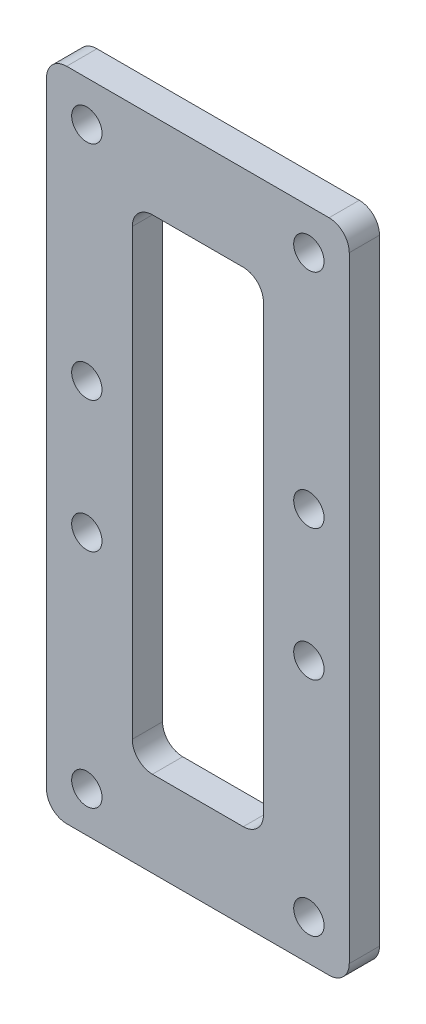
ISO-10303-21;
HEADER;
FILE_DESCRIPTION(('STEP AP214'),'2;1');
FILE_NAME('part.step','',(''),(''),'','','');
FILE_SCHEMA(('AUTOMOTIVE_DESIGN { 1 0 10303 214 1 1 1 1 }'));
ENDSEC;
DATA;
#1=APPLICATION_CONTEXT('core data for automotive mechanical design processes');
#2=APPLICATION_PROTOCOL_DEFINITION('international standard','automotive_design',2000,#1);
#3=PRODUCT_CONTEXT('',#1,'mechanical');
#4=PRODUCT('Part','Part','',(#3));
#5=PRODUCT_RELATED_PRODUCT_CATEGORY('part','',(#4));
#6=PRODUCT_DEFINITION_FORMATION('','',#4);
#7=PRODUCT_DEFINITION_CONTEXT('part definition',#1,'design');
#8=PRODUCT_DEFINITION('design','',#6,#7);
#9=PRODUCT_DEFINITION_SHAPE('','',#8);
#10=(LENGTH_UNIT() NAMED_UNIT(*) SI_UNIT(.MILLI.,.METRE.));
#11=(NAMED_UNIT(*) PLANE_ANGLE_UNIT() SI_UNIT($,.RADIAN.));
#12=(NAMED_UNIT(*) SI_UNIT($,.STERADIAN.) SOLID_ANGLE_UNIT());
#13=UNCERTAINTY_MEASURE_WITH_UNIT(LENGTH_MEASURE(1.E-05),#10,'distance_accuracy_value','');
#14=(GEOMETRIC_REPRESENTATION_CONTEXT(3) GLOBAL_UNCERTAINTY_ASSIGNED_CONTEXT((#13)) GLOBAL_UNIT_ASSIGNED_CONTEXT((#10,
#11,#12)) REPRESENTATION_CONTEXT('',''));
#15=CARTESIAN_POINT('',(0.,0.,0.));
#16=DIRECTION('',(0.,0.,1.));
#17=DIRECTION('',(1.,0.,0.));
#18=AXIS2_PLACEMENT_3D('',#15,#16,#17);
#19=CARTESIAN_POINT('',(15.,-32.5,3.));
#20=DIRECTION('',(-1.,0.,0.));
#21=DIRECTION('',(0.,0.,1.));
#22=AXIS2_PLACEMENT_3D('',#19,#20,#21);
#23=PLANE('',#22);
#24=DIRECTION('',(0.,1.,0.));
#25=VECTOR('',#24,1.);
#26=CARTESIAN_POINT('',(15.,-32.5,3.));
#27=LINE('',#26,#25);
#28=CARTESIAN_POINT('',(15.,-30.5,3.));
#29=VERTEX_POINT('',#28);
#30=CARTESIAN_POINT('',(15.,30.5,3.));
#31=VERTEX_POINT('',#30);
#32=EDGE_CURVE('E167',#29,#31,#27,.T.);
#33=ORIENTED_EDGE('',*,*,#32,.F.);
#34=DIRECTION('',(0.,0.,-1.));
#35=VECTOR('',#34,1.);
#36=CARTESIAN_POINT('',(15.,-30.5,3.));
#37=LINE('',#36,#35);
#38=CARTESIAN_POINT('',(15.,-30.5,0.));
#39=VERTEX_POINT('',#38);
#40=EDGE_CURVE('E152',#29,#39,#37,.T.);
#41=ORIENTED_EDGE('',*,*,#40,.T.);
#42=DIRECTION('',(0.,1.,0.));
#43=VECTOR('',#42,1.);
#44=CARTESIAN_POINT('',(15.,-32.5,0.));
#45=LINE('',#44,#43);
#46=CARTESIAN_POINT('',(15.,30.5,0.));
#47=VERTEX_POINT('',#46);
#48=EDGE_CURVE('E164',#39,#47,#45,.T.);
#49=ORIENTED_EDGE('',*,*,#48,.T.);
#50=DIRECTION('',(0.,0.,-1.));
#51=VECTOR('',#50,1.);
#52=CARTESIAN_POINT('',(15.,30.5,3.));
#53=LINE('',#52,#51);
#54=EDGE_CURVE('E169',#47,#31,#53,.F.);
#55=ORIENTED_EDGE('',*,*,#54,.T.);
#56=EDGE_LOOP('',(#33,#41,#49,#55));
#57=FACE_BOUND('',#56,.T.);
#58=ADVANCED_FACE('F35',(#57),#23,.F.);
#59=CARTESIAN_POINT('',(-15.,32.5,3.));
#60=DIRECTION('',(0.,-1.,0.));
#61=DIRECTION('',(0.,0.,-1.));
#62=AXIS2_PLACEMENT_3D('',#59,#60,#61);
#63=PLANE('',#62);
#64=DIRECTION('',(-1.,0.,0.));
#65=VECTOR('',#64,1.);
#66=CARTESIAN_POINT('',(-15.,32.5,0.));
#67=LINE('',#66,#65);
#68=CARTESIAN_POINT('',(13.,32.5,0.));
#69=VERTEX_POINT('',#68);
#70=CARTESIAN_POINT('',(-13.,32.5,0.));
#71=VERTEX_POINT('',#70);
#72=EDGE_CURVE('E173',#69,#71,#67,.T.);
#73=ORIENTED_EDGE('',*,*,#72,.T.);
#74=DIRECTION('',(0.,0.,-1.));
#75=VECTOR('',#74,1.);
#76=CARTESIAN_POINT('',(-13.,32.5,3.));
#77=LINE('',#76,#75);
#78=CARTESIAN_POINT('',(-13.,32.5,3.));
#79=VERTEX_POINT('',#78);
#80=EDGE_CURVE('E214',#71,#79,#77,.F.);
#81=ORIENTED_EDGE('',*,*,#80,.T.);
#82=DIRECTION('',(-1.,0.,0.));
#83=VECTOR('',#82,1.);
#84=CARTESIAN_POINT('',(-15.,32.5,3.));
#85=LINE('',#84,#83);
#86=CARTESIAN_POINT('',(13.,32.5,3.));
#87=VERTEX_POINT('',#86);
#88=EDGE_CURVE('E376',#87,#79,#85,.T.);
#89=ORIENTED_EDGE('',*,*,#88,.F.);
#90=DIRECTION('',(0.,0.,-1.));
#91=VECTOR('',#90,1.);
#92=CARTESIAN_POINT('',(13.,32.5,3.));
#93=LINE('',#92,#91);
#94=EDGE_CURVE('E211',#87,#69,#93,.T.);
#95=ORIENTED_EDGE('',*,*,#94,.T.);
#96=EDGE_LOOP('',(#73,#81,#89,#95));
#97=FACE_BOUND('',#96,.T.);
#98=ADVANCED_FACE('F279',(#97),#63,.F.);
#99=CARTESIAN_POINT('',(-15.,-32.5,3.));
#100=DIRECTION('',(1.,0.,0.));
#101=DIRECTION('',(0.,0.,-1.));
#102=AXIS2_PLACEMENT_3D('',#99,#100,#101);
#103=PLANE('',#102);
#104=DIRECTION('',(0.,-1.,0.));
#105=VECTOR('',#104,1.);
#106=CARTESIAN_POINT('',(-15.,-32.5,0.));
#107=LINE('',#106,#105);
#108=CARTESIAN_POINT('',(-15.,30.5,0.));
#109=VERTEX_POINT('',#108);
#110=CARTESIAN_POINT('',(-15.,-30.5,0.));
#111=VERTEX_POINT('',#110);
#112=EDGE_CURVE('E177',#109,#111,#107,.T.);
#113=ORIENTED_EDGE('',*,*,#112,.T.);
#114=DIRECTION('',(0.,0.,-1.));
#115=VECTOR('',#114,1.);
#116=CARTESIAN_POINT('',(-15.,-30.5,3.));
#117=LINE('',#116,#115);
#118=CARTESIAN_POINT('',(-15.,-30.5,3.));
#119=VERTEX_POINT('',#118);
#120=EDGE_CURVE('E209',#111,#119,#117,.F.);
#121=ORIENTED_EDGE('',*,*,#120,.T.);
#122=DIRECTION('',(0.,-1.,0.));
#123=VECTOR('',#122,1.);
#124=CARTESIAN_POINT('',(-15.,-32.5,3.));
#125=LINE('',#124,#123);
#126=CARTESIAN_POINT('',(-15.,30.5,3.));
#127=VERTEX_POINT('',#126);
#128=EDGE_CURVE('E378',#127,#119,#125,.T.);
#129=ORIENTED_EDGE('',*,*,#128,.F.);
#130=DIRECTION('',(0.,0.,-1.));
#131=VECTOR('',#130,1.);
#132=CARTESIAN_POINT('',(-15.,30.5,3.));
#133=LINE('',#132,#131);
#134=EDGE_CURVE('E206',#127,#109,#133,.T.);
#135=ORIENTED_EDGE('',*,*,#134,.T.);
#136=EDGE_LOOP('',(#113,#121,#129,#135));
#137=FACE_BOUND('',#136,.T.);
#138=ADVANCED_FACE('F284',(#137),#103,.F.);
#139=CARTESIAN_POINT('',(-15.,-32.5,3.));
#140=DIRECTION('',(0.,1.,0.));
#141=DIRECTION('',(0.,0.,1.));
#142=AXIS2_PLACEMENT_3D('',#139,#140,#141);
#143=PLANE('',#142);
#144=DIRECTION('',(1.,0.,0.));
#145=VECTOR('',#144,1.);
#146=CARTESIAN_POINT('',(-15.,-32.5,0.));
#147=LINE('',#146,#145);
#148=CARTESIAN_POINT('',(-13.,-32.5,0.));
#149=VERTEX_POINT('',#148);
#150=CARTESIAN_POINT('',(13.,-32.5,0.));
#151=VERTEX_POINT('',#150);
#152=EDGE_CURVE('E188',#149,#151,#147,.T.);
#153=ORIENTED_EDGE('',*,*,#152,.T.);
#154=DIRECTION('',(0.,0.,-1.));
#155=VECTOR('',#154,1.);
#156=CARTESIAN_POINT('',(13.,-32.5,3.));
#157=LINE('',#156,#155);
#158=CARTESIAN_POINT('',(13.,-32.5,3.));
#159=VERTEX_POINT('',#158);
#160=EDGE_CURVE('E153',#151,#159,#157,.F.);
#161=ORIENTED_EDGE('',*,*,#160,.T.);
#162=DIRECTION('',(1.,0.,0.));
#163=VECTOR('',#162,1.);
#164=CARTESIAN_POINT('',(-15.,-32.5,3.));
#165=LINE('',#164,#163);
#166=CARTESIAN_POINT('',(-13.,-32.5,3.));
#167=VERTEX_POINT('',#166);
#168=EDGE_CURVE('E183',#167,#159,#165,.T.);
#169=ORIENTED_EDGE('',*,*,#168,.F.);
#170=DIRECTION('',(0.,0.,-1.));
#171=VECTOR('',#170,1.);
#172=CARTESIAN_POINT('',(-13.,-32.5,3.));
#173=LINE('',#172,#171);
#174=EDGE_CURVE('E158',#167,#149,#173,.T.);
#175=ORIENTED_EDGE('',*,*,#174,.T.);
#176=EDGE_LOOP('',(#153,#161,#169,#175));
#177=FACE_BOUND('',#176,.T.);
#178=ADVANCED_FACE('F388',(#177),#143,.F.);
#179=CARTESIAN_POINT('',(0.,0.,3.));
#180=DIRECTION('',(0.,0.,-1.));
#181=DIRECTION('',(-1.,0.,0.));
#182=AXIS2_PLACEMENT_3D('',#179,#180,#181);
#183=PLANE('',#182);
#184=DIRECTION('',(-1.,0.,0.));
#185=VECTOR('',#184,1.);
#186=CARTESIAN_POINT('',(-6.5,24.,3.));
#187=LINE('',#186,#185);
#188=CARTESIAN_POINT('',(4.5,24.,3.));
#189=VERTEX_POINT('',#188);
#190=CARTESIAN_POINT('',(-4.5,24.,3.));
#191=VERTEX_POINT('',#190);
#192=EDGE_CURVE('E323',#189,#191,#187,.T.);
#193=ORIENTED_EDGE('',*,*,#192,.F.);
#194=CARTESIAN_POINT('',(4.5,22.,3.));
#195=DIRECTION('',(0.,0.,-1.));
#196=DIRECTION('',(-1.,0.,0.));
#197=AXIS2_PLACEMENT_3D('',#194,#195,#196);
#198=CIRCLE('',#197,2.);
#199=CARTESIAN_POINT('',(6.5,22.,3.));
#200=VERTEX_POINT('',#199);
#201=EDGE_CURVE('E251',#189,#200,#198,.T.);
#202=ORIENTED_EDGE('',*,*,#201,.T.);
#203=DIRECTION('',(0.,1.,0.));
#204=VECTOR('',#203,1.);
#205=CARTESIAN_POINT('',(6.5,-24.,3.));
#206=LINE('',#205,#204);
#207=CARTESIAN_POINT('',(6.5,-22.,3.));
#208=VERTEX_POINT('',#207);
#209=EDGE_CURVE('E328',#208,#200,#206,.T.);
#210=ORIENTED_EDGE('',*,*,#209,.F.);
#211=CARTESIAN_POINT('',(4.5,-22.,3.));
#212=DIRECTION('',(0.,0.,-1.));
#213=DIRECTION('',(-1.,0.,0.));
#214=AXIS2_PLACEMENT_3D('',#211,#212,#213);
#215=CIRCLE('',#214,2.);
#216=CARTESIAN_POINT('',(4.5,-24.,3.));
#217=VERTEX_POINT('',#216);
#218=EDGE_CURVE('E43',#208,#217,#215,.T.);
#219=ORIENTED_EDGE('',*,*,#218,.T.);
#220=DIRECTION('',(1.,0.,0.));
#221=VECTOR('',#220,1.);
#222=CARTESIAN_POINT('',(-6.49999999999999,-24.,3.));
#223=LINE('',#222,#221);
#224=CARTESIAN_POINT('',(-4.49999999999999,-24.,3.));
#225=VERTEX_POINT('',#224);
#226=EDGE_CURVE('E322',#225,#217,#223,.T.);
#227=ORIENTED_EDGE('',*,*,#226,.F.);
#228=CARTESIAN_POINT('',(-4.49999999999999,-22.,3.));
#229=DIRECTION('',(0.,0.,-1.));
#230=DIRECTION('',(-1.,0.,0.));
#231=AXIS2_PLACEMENT_3D('',#228,#229,#230);
#232=CIRCLE('',#231,2.);
#233=CARTESIAN_POINT('',(-6.49999999999999,-22.,3.));
#234=VERTEX_POINT('',#233);
#235=EDGE_CURVE('E57',#225,#234,#232,.T.);
#236=ORIENTED_EDGE('',*,*,#235,.T.);
#237=DIRECTION('',(0.,-1.,0.));
#238=VECTOR('',#237,1.);
#239=CARTESIAN_POINT('',(-6.49999999999999,-24.,3.));
#240=LINE('',#239,#238);
#241=CARTESIAN_POINT('',(-6.5,22.,3.));
#242=VERTEX_POINT('',#241);
#243=EDGE_CURVE('E321',#242,#234,#240,.T.);
#244=ORIENTED_EDGE('',*,*,#243,.F.);
#245=CARTESIAN_POINT('',(-4.5,22.,3.));
#246=DIRECTION('',(0.,0.,-1.));
#247=DIRECTION('',(-1.,0.,0.));
#248=AXIS2_PLACEMENT_3D('',#245,#246,#247);
#249=CIRCLE('',#248,2.);
#250=EDGE_CURVE('E247',#242,#191,#249,.T.);
#251=ORIENTED_EDGE('',*,*,#250,.T.);
#252=EDGE_LOOP('',(#193,#202,#210,#219,#227,#236,#244,#251));
#253=FACE_BOUND('',#252,.T.);
#254=CARTESIAN_POINT('',(11.,-28.5,3.));
#255=DIRECTION('',(0.,0.,-1.));
#256=DIRECTION('',(1.,0.,0.));
#257=AXIS2_PLACEMENT_3D('',#254,#255,#256);
#258=CIRCLE('',#257,1.505);
#259=CARTESIAN_POINT('',(12.505,-28.5,3.));
#260=VERTEX_POINT('',#259);
#261=EDGE_CURVE('E342',#260,#260,#258,.T.);
#262=ORIENTED_EDGE('',*,*,#261,.T.);
#263=EDGE_LOOP('',(#262));
#264=FACE_BOUND('',#263,.T.);
#265=CARTESIAN_POINT('',(-11.,-6.50000000000002,3.));
#266=DIRECTION('',(0.,0.,-1.));
#267=DIRECTION('',(1.,0.,0.));
#268=AXIS2_PLACEMENT_3D('',#265,#266,#267);
#269=CIRCLE('',#268,1.505);
#270=CARTESIAN_POINT('',(-9.495,-6.50000000000002,3.));
#271=VERTEX_POINT('',#270);
#272=EDGE_CURVE('E335',#271,#271,#269,.T.);
#273=ORIENTED_EDGE('',*,*,#272,.T.);
#274=EDGE_LOOP('',(#273));
#275=FACE_BOUND('',#274,.T.);
#276=CARTESIAN_POINT('',(11.,-6.50000000000002,3.));
#277=DIRECTION('',(0.,0.,-1.));
#278=DIRECTION('',(1.,0.,0.));
#279=AXIS2_PLACEMENT_3D('',#276,#277,#278);
#280=CIRCLE('',#279,1.505);
#281=CARTESIAN_POINT('',(12.505,-6.50000000000002,3.));
#282=VERTEX_POINT('',#281);
#283=EDGE_CURVE('E325',#282,#282,#280,.T.);
#284=ORIENTED_EDGE('',*,*,#283,.T.);
#285=EDGE_LOOP('',(#284));
#286=FACE_BOUND('',#285,.T.);
#287=CARTESIAN_POINT('',(-11.,-28.5,3.));
#288=DIRECTION('',(0.,0.,-1.));
#289=DIRECTION('',(1.,0.,0.));
#290=AXIS2_PLACEMENT_3D('',#287,#288,#289);
#291=CIRCLE('',#290,1.505);
#292=CARTESIAN_POINT('',(-9.495,-28.5,3.));
#293=VERTEX_POINT('',#292);
#294=EDGE_CURVE('E341',#293,#293,#291,.T.);
#295=ORIENTED_EDGE('',*,*,#294,.T.);
#296=EDGE_LOOP('',(#295));
#297=FACE_BOUND('',#296,.T.);
#298=CARTESIAN_POINT('',(11.,28.5,3.));
#299=DIRECTION('',(0.,0.,1.));
#300=DIRECTION('',(1.,0.,0.));
#301=AXIS2_PLACEMENT_3D('',#298,#299,#300);
#302=CIRCLE('',#301,1.505);
#303=CARTESIAN_POINT('',(12.505,28.5,3.));
#304=VERTEX_POINT('',#303);
#305=EDGE_CURVE('E365',#304,#304,#302,.T.);
#306=ORIENTED_EDGE('',*,*,#305,.F.);
#307=EDGE_LOOP('',(#306));
#308=FACE_BOUND('',#307,.T.);
#309=CARTESIAN_POINT('',(-11.,6.50000000000002,3.));
#310=DIRECTION('',(0.,0.,1.));
#311=DIRECTION('',(1.,0.,0.));
#312=AXIS2_PLACEMENT_3D('',#309,#310,#311);
#313=CIRCLE('',#312,1.505);
#314=CARTESIAN_POINT('',(-9.495,6.50000000000002,3.));
#315=VERTEX_POINT('',#314);
#316=EDGE_CURVE('E359',#315,#315,#313,.T.);
#317=ORIENTED_EDGE('',*,*,#316,.F.);
#318=EDGE_LOOP('',(#317));
#319=FACE_BOUND('',#318,.T.);
#320=CARTESIAN_POINT('',(11.,6.50000000000002,3.));
#321=DIRECTION('',(0.,0.,1.));
#322=DIRECTION('',(1.,0.,0.));
#323=AXIS2_PLACEMENT_3D('',#320,#321,#322);
#324=CIRCLE('',#323,1.505);
#325=CARTESIAN_POINT('',(12.505,6.50000000000002,3.));
#326=VERTEX_POINT('',#325);
#327=EDGE_CURVE('E353',#326,#326,#324,.T.);
#328=ORIENTED_EDGE('',*,*,#327,.F.);
#329=EDGE_LOOP('',(#328));
#330=FACE_BOUND('',#329,.T.);
#331=CARTESIAN_POINT('',(-11.,28.5,3.));
#332=DIRECTION('',(0.,0.,1.));
#333=DIRECTION('',(1.,0.,0.));
#334=AXIS2_PLACEMENT_3D('',#331,#332,#333);
#335=CIRCLE('',#334,1.505);
#336=CARTESIAN_POINT('',(-9.495,28.5,3.));
#337=VERTEX_POINT('',#336);
#338=EDGE_CURVE('E180',#337,#337,#335,.T.);
#339=ORIENTED_EDGE('',*,*,#338,.F.);
#340=EDGE_LOOP('',(#339));
#341=FACE_BOUND('',#340,.T.);
#342=ORIENTED_EDGE('',*,*,#168,.T.);
#343=CARTESIAN_POINT('',(13.,-30.5,3.));
#344=DIRECTION('',(0.,0.,-1.));
#345=DIRECTION('',(-1.,0.,0.));
#346=AXIS2_PLACEMENT_3D('',#343,#344,#345);
#347=CIRCLE('',#346,2.);
#348=EDGE_CURVE('E204',#159,#29,#347,.F.);
#349=ORIENTED_EDGE('',*,*,#348,.T.);
#350=ORIENTED_EDGE('',*,*,#32,.T.);
#351=CARTESIAN_POINT('',(13.,30.5,3.));
#352=DIRECTION('',(0.,0.,-1.));
#353=DIRECTION('',(-1.,0.,0.));
#354=AXIS2_PLACEMENT_3D('',#351,#352,#353);
#355=CIRCLE('',#354,2.);
#356=EDGE_CURVE('E198',#31,#87,#355,.F.);
#357=ORIENTED_EDGE('',*,*,#356,.T.);
#358=ORIENTED_EDGE('',*,*,#88,.T.);
#359=CARTESIAN_POINT('',(-13.,30.5,3.));
#360=DIRECTION('',(0.,0.,-1.));
#361=DIRECTION('',(-1.,0.,0.));
#362=AXIS2_PLACEMENT_3D('',#359,#360,#361);
#363=CIRCLE('',#362,2.);
#364=EDGE_CURVE('E200',#79,#127,#363,.F.);
#365=ORIENTED_EDGE('',*,*,#364,.T.);
#366=ORIENTED_EDGE('',*,*,#128,.T.);
#367=CARTESIAN_POINT('',(-13.,-30.5,3.));
#368=DIRECTION('',(0.,0.,-1.));
#369=DIRECTION('',(-1.,0.,0.));
#370=AXIS2_PLACEMENT_3D('',#367,#368,#369);
#371=CIRCLE('',#370,2.);
#372=EDGE_CURVE('E202',#119,#167,#371,.F.);
#373=ORIENTED_EDGE('',*,*,#372,.T.);
#374=EDGE_LOOP('',(#342,#349,#350,#357,#358,#365,#366,#373));
#375=FACE_BOUND('',#374,.T.);
#376=ADVANCED_FACE('F385',(#253,#264,#275,#286,#297,#308,#319,#330,#341,#375),#183,.F.);
#377=CARTESIAN_POINT('',(0.,0.,0.));
#378=DIRECTION('',(0.,0.,-1.));
#379=DIRECTION('',(-1.,0.,0.));
#380=AXIS2_PLACEMENT_3D('',#377,#378,#379);
#381=PLANE('',#380);
#382=DIRECTION('',(0.,-1.,0.));
#383=VECTOR('',#382,1.);
#384=CARTESIAN_POINT('',(6.5,0.,0.));
#385=LINE('',#384,#383);
#386=CARTESIAN_POINT('',(6.5,22.,0.));
#387=VERTEX_POINT('',#386);
#388=CARTESIAN_POINT('',(6.5,-22.,0.));
#389=VERTEX_POINT('',#388);
#390=EDGE_CURVE('E225',#387,#389,#385,.T.);
#391=ORIENTED_EDGE('',*,*,#390,.F.);
#392=CARTESIAN_POINT('',(4.5,22.,0.));
#393=DIRECTION('',(0.,0.,-1.));
#394=DIRECTION('',(-1.,0.,0.));
#395=AXIS2_PLACEMENT_3D('',#392,#393,#394);
#396=CIRCLE('',#395,2.);
#397=CARTESIAN_POINT('',(4.5,24.,0.));
#398=VERTEX_POINT('',#397);
#399=EDGE_CURVE('E253',#387,#398,#396,.F.);
#400=ORIENTED_EDGE('',*,*,#399,.T.);
#401=DIRECTION('',(1.,0.,0.));
#402=VECTOR('',#401,1.);
#403=CARTESIAN_POINT('',(0.,24.,0.));
#404=LINE('',#403,#402);
#405=CARTESIAN_POINT('',(-4.5,24.,0.));
#406=VERTEX_POINT('',#405);
#407=EDGE_CURVE('E216',#406,#398,#404,.T.);
#408=ORIENTED_EDGE('',*,*,#407,.F.);
#409=CARTESIAN_POINT('',(-4.5,22.,0.));
#410=DIRECTION('',(0.,0.,-1.));
#411=DIRECTION('',(-1.,0.,0.));
#412=AXIS2_PLACEMENT_3D('',#409,#410,#411);
#413=CIRCLE('',#412,2.);
#414=CARTESIAN_POINT('',(-6.5,22.,0.));
#415=VERTEX_POINT('',#414);
#416=EDGE_CURVE('E249',#406,#415,#413,.F.);
#417=ORIENTED_EDGE('',*,*,#416,.T.);
#418=DIRECTION('',(0.,1.,0.));
#419=VECTOR('',#418,1.);
#420=CARTESIAN_POINT('',(-6.49999999999999,0.,0.));
#421=LINE('',#420,#419);
#422=CARTESIAN_POINT('',(-6.49999999999999,-22.,0.));
#423=VERTEX_POINT('',#422);
#424=EDGE_CURVE('E219',#423,#415,#421,.T.);
#425=ORIENTED_EDGE('',*,*,#424,.F.);
#426=CARTESIAN_POINT('',(-4.49999999999999,-22.,0.));
#427=DIRECTION('',(0.,0.,-1.));
#428=DIRECTION('',(-1.,0.,0.));
#429=AXIS2_PLACEMENT_3D('',#426,#427,#428);
#430=CIRCLE('',#429,2.);
#431=CARTESIAN_POINT('',(-4.49999999999999,-24.,0.));
#432=VERTEX_POINT('',#431);
#433=EDGE_CURVE('E256',#423,#432,#430,.F.);
#434=ORIENTED_EDGE('',*,*,#433,.T.);
#435=DIRECTION('',(-1.,0.,0.));
#436=VECTOR('',#435,1.);
#437=CARTESIAN_POINT('',(0.,-24.,0.));
#438=LINE('',#437,#436);
#439=CARTESIAN_POINT('',(4.5,-24.,0.));
#440=VERTEX_POINT('',#439);
#441=EDGE_CURVE('E222',#440,#432,#438,.T.);
#442=ORIENTED_EDGE('',*,*,#441,.F.);
#443=CARTESIAN_POINT('',(4.5,-22.,0.));
#444=DIRECTION('',(0.,0.,-1.));
#445=DIRECTION('',(-1.,0.,0.));
#446=AXIS2_PLACEMENT_3D('',#443,#444,#445);
#447=CIRCLE('',#446,2.);
#448=EDGE_CURVE('E11',#440,#389,#447,.F.);
#449=ORIENTED_EDGE('',*,*,#448,.T.);
#450=EDGE_LOOP('',(#391,#400,#408,#417,#425,#434,#442,#449));
#451=FACE_BOUND('',#450,.T.);
#452=CARTESIAN_POINT('',(11.,-28.5,0.));
#453=DIRECTION('',(0.,0.,-1.));
#454=DIRECTION('',(1.,0.,0.));
#455=AXIS2_PLACEMENT_3D('',#452,#453,#454);
#456=CIRCLE('',#455,1.505);
#457=CARTESIAN_POINT('',(12.505,-28.5,0.));
#458=VERTEX_POINT('',#457);
#459=EDGE_CURVE('E338',#458,#458,#456,.T.);
#460=ORIENTED_EDGE('',*,*,#459,.F.);
#461=EDGE_LOOP('',(#460));
#462=FACE_BOUND('',#461,.T.);
#463=CARTESIAN_POINT('',(-11.,-6.50000000000002,0.));
#464=DIRECTION('',(0.,0.,-1.));
#465=DIRECTION('',(1.,0.,0.));
#466=AXIS2_PLACEMENT_3D('',#463,#464,#465);
#467=CIRCLE('',#466,1.505);
#468=CARTESIAN_POINT('',(-9.495,-6.50000000000002,0.));
#469=VERTEX_POINT('',#468);
#470=EDGE_CURVE('E345',#469,#469,#467,.T.);
#471=ORIENTED_EDGE('',*,*,#470,.F.);
#472=EDGE_LOOP('',(#471));
#473=FACE_BOUND('',#472,.T.);
#474=CARTESIAN_POINT('',(11.,-6.50000000000002,0.));
#475=DIRECTION('',(0.,0.,-1.));
#476=DIRECTION('',(1.,0.,0.));
#477=AXIS2_PLACEMENT_3D('',#474,#475,#476);
#478=CIRCLE('',#477,1.505);
#479=CARTESIAN_POINT('',(12.505,-6.50000000000002,0.));
#480=VERTEX_POINT('',#479);
#481=EDGE_CURVE('E332',#480,#480,#478,.T.);
#482=ORIENTED_EDGE('',*,*,#481,.F.);
#483=EDGE_LOOP('',(#482));
#484=FACE_BOUND('',#483,.T.);
#485=CARTESIAN_POINT('',(-11.,-28.5,0.));
#486=DIRECTION('',(0.,0.,-1.));
#487=DIRECTION('',(1.,0.,0.));
#488=AXIS2_PLACEMENT_3D('',#485,#486,#487);
#489=CIRCLE('',#488,1.505);
#490=CARTESIAN_POINT('',(-9.495,-28.5,0.));
#491=VERTEX_POINT('',#490);
#492=EDGE_CURVE('E350',#491,#491,#489,.T.);
#493=ORIENTED_EDGE('',*,*,#492,.F.);
#494=EDGE_LOOP('',(#493));
#495=FACE_BOUND('',#494,.T.);
#496=CARTESIAN_POINT('',(11.,28.5,0.));
#497=DIRECTION('',(0.,0.,1.));
#498=DIRECTION('',(1.,0.,0.));
#499=AXIS2_PLACEMENT_3D('',#496,#497,#498);
#500=CIRCLE('',#499,1.505);
#501=CARTESIAN_POINT('',(12.505,28.5,0.));
#502=VERTEX_POINT('',#501);
#503=EDGE_CURVE('E362',#502,#502,#500,.T.);
#504=ORIENTED_EDGE('',*,*,#503,.T.);
#505=EDGE_LOOP('',(#504));
#506=FACE_BOUND('',#505,.T.);
#507=CARTESIAN_POINT('',(-11.,6.50000000000002,0.));
#508=DIRECTION('',(0.,0.,1.));
#509=DIRECTION('',(1.,0.,0.));
#510=AXIS2_PLACEMENT_3D('',#507,#508,#509);
#511=CIRCLE('',#510,1.505);
#512=CARTESIAN_POINT('',(-9.495,6.50000000000002,0.));
#513=VERTEX_POINT('',#512);
#514=EDGE_CURVE('E368',#513,#513,#511,.T.);
#515=ORIENTED_EDGE('',*,*,#514,.T.);
#516=EDGE_LOOP('',(#515));
#517=FACE_BOUND('',#516,.T.);
#518=CARTESIAN_POINT('',(11.,6.50000000000002,0.));
#519=DIRECTION('',(0.,0.,1.));
#520=DIRECTION('',(1.,0.,0.));
#521=AXIS2_PLACEMENT_3D('',#518,#519,#520);
#522=CIRCLE('',#521,1.505);
#523=CARTESIAN_POINT('',(12.505,6.50000000000002,0.));
#524=VERTEX_POINT('',#523);
#525=EDGE_CURVE('E356',#524,#524,#522,.T.);
#526=ORIENTED_EDGE('',*,*,#525,.T.);
#527=EDGE_LOOP('',(#526));
#528=FACE_BOUND('',#527,.T.);
#529=CARTESIAN_POINT('',(-11.,28.5,0.));
#530=DIRECTION('',(0.,0.,1.));
#531=DIRECTION('',(1.,0.,0.));
#532=AXIS2_PLACEMENT_3D('',#529,#530,#531);
#533=CIRCLE('',#532,1.505);
#534=CARTESIAN_POINT('',(-9.495,28.5,0.));
#535=VERTEX_POINT('',#534);
#536=EDGE_CURVE('E174',#535,#535,#533,.T.);
#537=ORIENTED_EDGE('',*,*,#536,.T.);
#538=EDGE_LOOP('',(#537));
#539=FACE_BOUND('',#538,.T.);
#540=ORIENTED_EDGE('',*,*,#48,.F.);
#541=CARTESIAN_POINT('',(13.,-30.5,0.));
#542=DIRECTION('',(0.,0.,-1.));
#543=DIRECTION('',(-1.,0.,0.));
#544=AXIS2_PLACEMENT_3D('',#541,#542,#543);
#545=CIRCLE('',#544,2.);
#546=EDGE_CURVE('E148',#39,#151,#545,.T.);
#547=ORIENTED_EDGE('',*,*,#546,.T.);
#548=ORIENTED_EDGE('',*,*,#152,.F.);
#549=CARTESIAN_POINT('',(-13.,-30.5,0.));
#550=DIRECTION('',(0.,0.,-1.));
#551=DIRECTION('',(-1.,0.,0.));
#552=AXIS2_PLACEMENT_3D('',#549,#550,#551);
#553=CIRCLE('',#552,2.);
#554=EDGE_CURVE('E159',#149,#111,#553,.T.);
#555=ORIENTED_EDGE('',*,*,#554,.T.);
#556=ORIENTED_EDGE('',*,*,#112,.F.);
#557=CARTESIAN_POINT('',(-13.,30.5,0.));
#558=DIRECTION('',(0.,0.,-1.));
#559=DIRECTION('',(-1.,0.,0.));
#560=AXIS2_PLACEMENT_3D('',#557,#558,#559);
#561=CIRCLE('',#560,2.);
#562=EDGE_CURVE('E192',#109,#71,#561,.T.);
#563=ORIENTED_EDGE('',*,*,#562,.T.);
#564=ORIENTED_EDGE('',*,*,#72,.F.);
#565=CARTESIAN_POINT('',(13.,30.5,0.));
#566=DIRECTION('',(0.,0.,-1.));
#567=DIRECTION('',(-1.,0.,0.));
#568=AXIS2_PLACEMENT_3D('',#565,#566,#567);
#569=CIRCLE('',#568,2.);
#570=EDGE_CURVE('E168',#69,#47,#569,.T.);
#571=ORIENTED_EDGE('',*,*,#570,.T.);
#572=EDGE_LOOP('',(#540,#547,#548,#555,#556,#563,#564,#571));
#573=FACE_BOUND('',#572,.T.);
#574=ADVANCED_FACE('F171',(#451,#462,#473,#484,#495,#506,#517,#528,#539,#573),#381,.T.);
#575=CARTESIAN_POINT('',(-11.,28.5,0.));
#576=DIRECTION('',(0.,0.,1.));
#577=DIRECTION('',(1.,0.,0.));
#578=AXIS2_PLACEMENT_3D('',#575,#576,#577);
#579=CYLINDRICAL_SURFACE('',#578,1.505);
#580=ORIENTED_EDGE('',*,*,#536,.F.);
#581=EDGE_LOOP('',(#580));
#582=FACE_BOUND('',#581,.T.);
#583=ORIENTED_EDGE('',*,*,#338,.T.);
#584=EDGE_LOOP('',(#583));
#585=FACE_BOUND('',#584,.T.);
#586=ADVANCED_FACE('F406',(#582,#585),#579,.F.);
#587=CARTESIAN_POINT('',(11.,6.50000000000002,0.));
#588=DIRECTION('',(0.,0.,1.));
#589=DIRECTION('',(1.,0.,0.));
#590=AXIS2_PLACEMENT_3D('',#587,#588,#589);
#591=CYLINDRICAL_SURFACE('',#590,1.505);
#592=ORIENTED_EDGE('',*,*,#525,.F.);
#593=EDGE_LOOP('',(#592));
#594=FACE_BOUND('',#593,.T.);
#595=ORIENTED_EDGE('',*,*,#327,.T.);
#596=EDGE_LOOP('',(#595));
#597=FACE_BOUND('',#596,.T.);
#598=ADVANCED_FACE('F411',(#594,#597),#591,.F.);
#599=CARTESIAN_POINT('',(-11.,6.50000000000002,0.));
#600=DIRECTION('',(0.,0.,1.));
#601=DIRECTION('',(1.,0.,0.));
#602=AXIS2_PLACEMENT_3D('',#599,#600,#601);
#603=CYLINDRICAL_SURFACE('',#602,1.505);
#604=ORIENTED_EDGE('',*,*,#514,.F.);
#605=EDGE_LOOP('',(#604));
#606=FACE_BOUND('',#605,.T.);
#607=ORIENTED_EDGE('',*,*,#316,.T.);
#608=EDGE_LOOP('',(#607));
#609=FACE_BOUND('',#608,.T.);
#610=ADVANCED_FACE('F413',(#606,#609),#603,.F.);
#611=CARTESIAN_POINT('',(11.,28.5,0.));
#612=DIRECTION('',(0.,0.,1.));
#613=DIRECTION('',(1.,0.,0.));
#614=AXIS2_PLACEMENT_3D('',#611,#612,#613);
#615=CYLINDRICAL_SURFACE('',#614,1.505);
#616=ORIENTED_EDGE('',*,*,#503,.F.);
#617=EDGE_LOOP('',(#616));
#618=FACE_BOUND('',#617,.T.);
#619=ORIENTED_EDGE('',*,*,#305,.T.);
#620=EDGE_LOOP('',(#619));
#621=FACE_BOUND('',#620,.T.);
#622=ADVANCED_FACE('F416',(#618,#621),#615,.F.);
#623=CARTESIAN_POINT('',(-11.,-28.5,0.));
#624=DIRECTION('',(0.,0.,1.));
#625=DIRECTION('',(1.,0.,0.));
#626=AXIS2_PLACEMENT_3D('',#623,#624,#625);
#627=CYLINDRICAL_SURFACE('',#626,1.505);
#628=ORIENTED_EDGE('',*,*,#492,.T.);
#629=EDGE_LOOP('',(#628));
#630=FACE_BOUND('',#629,.T.);
#631=ORIENTED_EDGE('',*,*,#294,.F.);
#632=EDGE_LOOP('',(#631));
#633=FACE_BOUND('',#632,.T.);
#634=ADVANCED_FACE('F420',(#630,#633),#627,.F.);
#635=CARTESIAN_POINT('',(11.,-6.50000000000002,0.));
#636=DIRECTION('',(0.,0.,1.));
#637=DIRECTION('',(1.,0.,0.));
#638=AXIS2_PLACEMENT_3D('',#635,#636,#637);
#639=CYLINDRICAL_SURFACE('',#638,1.505);
#640=ORIENTED_EDGE('',*,*,#481,.T.);
#641=EDGE_LOOP('',(#640));
#642=FACE_BOUND('',#641,.T.);
#643=ORIENTED_EDGE('',*,*,#283,.F.);
#644=EDGE_LOOP('',(#643));
#645=FACE_BOUND('',#644,.T.);
#646=ADVANCED_FACE('F427',(#642,#645),#639,.F.);
#647=CARTESIAN_POINT('',(-11.,-6.50000000000002,0.));
#648=DIRECTION('',(0.,0.,1.));
#649=DIRECTION('',(1.,0.,0.));
#650=AXIS2_PLACEMENT_3D('',#647,#648,#649);
#651=CYLINDRICAL_SURFACE('',#650,1.505);
#652=ORIENTED_EDGE('',*,*,#470,.T.);
#653=EDGE_LOOP('',(#652));
#654=FACE_BOUND('',#653,.T.);
#655=ORIENTED_EDGE('',*,*,#272,.F.);
#656=EDGE_LOOP('',(#655));
#657=FACE_BOUND('',#656,.T.);
#658=ADVANCED_FACE('F429',(#654,#657),#651,.F.);
#659=CARTESIAN_POINT('',(11.,-28.5,0.));
#660=DIRECTION('',(0.,0.,1.));
#661=DIRECTION('',(1.,0.,0.));
#662=AXIS2_PLACEMENT_3D('',#659,#660,#661);
#663=CYLINDRICAL_SURFACE('',#662,1.505);
#664=ORIENTED_EDGE('',*,*,#459,.T.);
#665=EDGE_LOOP('',(#664));
#666=FACE_BOUND('',#665,.T.);
#667=ORIENTED_EDGE('',*,*,#261,.F.);
#668=EDGE_LOOP('',(#667));
#669=FACE_BOUND('',#668,.T.);
#670=ADVANCED_FACE('F292',(#666,#669),#663,.F.);
#671=CARTESIAN_POINT('',(13.,-30.5,3.));
#672=DIRECTION('',(0.,0.,-1.));
#673=DIRECTION('',(-1.,0.,0.));
#674=AXIS2_PLACEMENT_3D('',#671,#672,#673);
#675=CYLINDRICAL_SURFACE('',#674,2.);
#676=ORIENTED_EDGE('',*,*,#348,.F.);
#677=ORIENTED_EDGE('',*,*,#160,.F.);
#678=ORIENTED_EDGE('',*,*,#546,.F.);
#679=ORIENTED_EDGE('',*,*,#40,.F.);
#680=EDGE_LOOP('',(#676,#677,#678,#679));
#681=FACE_BOUND('',#680,.T.);
#682=ADVANCED_FACE('F151',(#681),#675,.T.);
#683=CARTESIAN_POINT('',(-13.,-30.5,3.));
#684=DIRECTION('',(0.,0.,-1.));
#685=DIRECTION('',(-1.,0.,0.));
#686=AXIS2_PLACEMENT_3D('',#683,#684,#685);
#687=CYLINDRICAL_SURFACE('',#686,2.);
#688=ORIENTED_EDGE('',*,*,#372,.F.);
#689=ORIENTED_EDGE('',*,*,#120,.F.);
#690=ORIENTED_EDGE('',*,*,#554,.F.);
#691=ORIENTED_EDGE('',*,*,#174,.F.);
#692=EDGE_LOOP('',(#688,#689,#690,#691));
#693=FACE_BOUND('',#692,.T.);
#694=ADVANCED_FACE('F291',(#693),#687,.T.);
#695=CARTESIAN_POINT('',(-13.,30.5,3.));
#696=DIRECTION('',(0.,0.,-1.));
#697=DIRECTION('',(-1.,0.,0.));
#698=AXIS2_PLACEMENT_3D('',#695,#696,#697);
#699=CYLINDRICAL_SURFACE('',#698,2.);
#700=ORIENTED_EDGE('',*,*,#364,.F.);
#701=ORIENTED_EDGE('',*,*,#80,.F.);
#702=ORIENTED_EDGE('',*,*,#562,.F.);
#703=ORIENTED_EDGE('',*,*,#134,.F.);
#704=EDGE_LOOP('',(#700,#701,#702,#703));
#705=FACE_BOUND('',#704,.T.);
#706=ADVANCED_FACE('F295',(#705),#699,.T.);
#707=CARTESIAN_POINT('',(13.,30.5,3.));
#708=DIRECTION('',(0.,0.,-1.));
#709=DIRECTION('',(-1.,0.,0.));
#710=AXIS2_PLACEMENT_3D('',#707,#708,#709);
#711=CYLINDRICAL_SURFACE('',#710,2.);
#712=ORIENTED_EDGE('',*,*,#356,.F.);
#713=ORIENTED_EDGE('',*,*,#54,.F.);
#714=ORIENTED_EDGE('',*,*,#570,.F.);
#715=ORIENTED_EDGE('',*,*,#94,.F.);
#716=EDGE_LOOP('',(#712,#713,#714,#715));
#717=FACE_BOUND('',#716,.T.);
#718=ADVANCED_FACE('F299',(#717),#711,.T.);
#719=CARTESIAN_POINT('',(6.5,-24.,-7.));
#720=DIRECTION('',(1.,0.,0.));
#721=DIRECTION('',(0.,0.,-1.));
#722=AXIS2_PLACEMENT_3D('',#719,#720,#721);
#723=PLANE('',#722);
#724=ORIENTED_EDGE('',*,*,#209,.T.);
#725=DIRECTION('',(0.,0.,1.));
#726=VECTOR('',#725,1.);
#727=CARTESIAN_POINT('',(6.5,22.,0.));
#728=LINE('',#727,#726);
#729=EDGE_CURVE('E241',#200,#387,#728,.F.);
#730=ORIENTED_EDGE('',*,*,#729,.T.);
#731=ORIENTED_EDGE('',*,*,#390,.T.);
#732=DIRECTION('',(0.,0.,1.));
#733=VECTOR('',#732,1.);
#734=CARTESIAN_POINT('',(6.5,-22.,3.));
#735=LINE('',#734,#733);
#736=EDGE_CURVE('E238',#389,#208,#735,.T.);
#737=ORIENTED_EDGE('',*,*,#736,.T.);
#738=EDGE_LOOP('',(#724,#730,#731,#737));
#739=FACE_BOUND('',#738,.T.);
#740=ADVANCED_FACE('F303',(#739),#723,.F.);
#741=CARTESIAN_POINT('',(-6.49999999999999,-24.,-7.));
#742=DIRECTION('',(0.,-1.,0.));
#743=DIRECTION('',(0.,0.,-1.));
#744=AXIS2_PLACEMENT_3D('',#741,#742,#743);
#745=PLANE('',#744);
#746=ORIENTED_EDGE('',*,*,#441,.T.);
#747=DIRECTION('',(0.,0.,1.));
#748=VECTOR('',#747,1.);
#749=CARTESIAN_POINT('',(-4.49999999999999,-24.,3.));
#750=LINE('',#749,#748);
#751=EDGE_CURVE('E245',#432,#225,#750,.T.);
#752=ORIENTED_EDGE('',*,*,#751,.T.);
#753=ORIENTED_EDGE('',*,*,#226,.T.);
#754=DIRECTION('',(0.,0.,1.));
#755=VECTOR('',#754,1.);
#756=CARTESIAN_POINT('',(4.5,-24.,0.));
#757=LINE('',#756,#755);
#758=EDGE_CURVE('E243',#217,#440,#757,.F.);
#759=ORIENTED_EDGE('',*,*,#758,.T.);
#760=EDGE_LOOP('',(#746,#752,#753,#759));
#761=FACE_BOUND('',#760,.T.);
#762=ADVANCED_FACE('F265',(#761),#745,.F.);
#763=CARTESIAN_POINT('',(-6.49999999999999,-24.,-7.));
#764=DIRECTION('',(-1.,0.,0.));
#765=DIRECTION('',(0.,-1.,0.));
#766=AXIS2_PLACEMENT_3D('',#763,#764,#765);
#767=PLANE('',#766);
#768=ORIENTED_EDGE('',*,*,#424,.T.);
#769=DIRECTION('',(0.,0.,1.));
#770=VECTOR('',#769,1.);
#771=CARTESIAN_POINT('',(-6.5,22.,3.));
#772=LINE('',#771,#770);
#773=EDGE_CURVE('E230',#415,#242,#772,.T.);
#774=ORIENTED_EDGE('',*,*,#773,.T.);
#775=ORIENTED_EDGE('',*,*,#243,.T.);
#776=DIRECTION('',(0.,0.,1.));
#777=VECTOR('',#776,1.);
#778=CARTESIAN_POINT('',(-6.49999999999999,-22.,0.));
#779=LINE('',#778,#777);
#780=EDGE_CURVE('E228',#234,#423,#779,.F.);
#781=ORIENTED_EDGE('',*,*,#780,.T.);
#782=EDGE_LOOP('',(#768,#774,#775,#781));
#783=FACE_BOUND('',#782,.T.);
#784=ADVANCED_FACE('F311',(#783),#767,.F.);
#785=CARTESIAN_POINT('',(-6.5,24.,-7.));
#786=DIRECTION('',(0.,1.,0.));
#787=DIRECTION('',(0.,0.,1.));
#788=AXIS2_PLACEMENT_3D('',#785,#786,#787);
#789=PLANE('',#788);
#790=ORIENTED_EDGE('',*,*,#192,.T.);
#791=DIRECTION('',(0.,0.,1.));
#792=VECTOR('',#791,1.);
#793=CARTESIAN_POINT('',(-4.5,24.,0.));
#794=LINE('',#793,#792);
#795=EDGE_CURVE('E236',#191,#406,#794,.F.);
#796=ORIENTED_EDGE('',*,*,#795,.T.);
#797=ORIENTED_EDGE('',*,*,#407,.T.);
#798=DIRECTION('',(0.,0.,1.));
#799=VECTOR('',#798,1.);
#800=CARTESIAN_POINT('',(4.5,24.,3.));
#801=LINE('',#800,#799);
#802=EDGE_CURVE('E233',#398,#189,#801,.T.);
#803=ORIENTED_EDGE('',*,*,#802,.T.);
#804=EDGE_LOOP('',(#790,#796,#797,#803));
#805=FACE_BOUND('',#804,.T.);
#806=ADVANCED_FACE('F306',(#805),#789,.F.);
#807=CARTESIAN_POINT('',(-4.5,22.,-7.));
#808=DIRECTION('',(0.,0.,-1.));
#809=DIRECTION('',(-1.,0.,0.));
#810=AXIS2_PLACEMENT_3D('',#807,#808,#809);
#811=CYLINDRICAL_SURFACE('',#810,2.);
#812=ORIENTED_EDGE('',*,*,#416,.F.);
#813=ORIENTED_EDGE('',*,*,#795,.F.);
#814=ORIENTED_EDGE('',*,*,#250,.F.);
#815=ORIENTED_EDGE('',*,*,#773,.F.);
#816=EDGE_LOOP('',(#812,#813,#814,#815));
#817=FACE_BOUND('',#816,.T.);
#818=ADVANCED_FACE('F275',(#817),#811,.F.);
#819=CARTESIAN_POINT('',(4.5,22.,-7.));
#820=DIRECTION('',(0.,0.,-1.));
#821=DIRECTION('',(-1.,0.,0.));
#822=AXIS2_PLACEMENT_3D('',#819,#820,#821);
#823=CYLINDRICAL_SURFACE('',#822,2.);
#824=ORIENTED_EDGE('',*,*,#399,.F.);
#825=ORIENTED_EDGE('',*,*,#729,.F.);
#826=ORIENTED_EDGE('',*,*,#201,.F.);
#827=ORIENTED_EDGE('',*,*,#802,.F.);
#828=EDGE_LOOP('',(#824,#825,#826,#827));
#829=FACE_BOUND('',#828,.T.);
#830=ADVANCED_FACE('F269',(#829),#823,.F.);
#831=CARTESIAN_POINT('',(-4.49999999999999,-22.,-7.));
#832=DIRECTION('',(0.,0.,-1.));
#833=DIRECTION('',(-1.,0.,0.));
#834=AXIS2_PLACEMENT_3D('',#831,#832,#833);
#835=CYLINDRICAL_SURFACE('',#834,2.);
#836=ORIENTED_EDGE('',*,*,#433,.F.);
#837=ORIENTED_EDGE('',*,*,#780,.F.);
#838=ORIENTED_EDGE('',*,*,#235,.F.);
#839=ORIENTED_EDGE('',*,*,#751,.F.);
#840=EDGE_LOOP('',(#836,#837,#838,#839));
#841=FACE_BOUND('',#840,.T.);
#842=ADVANCED_FACE('F267',(#841),#835,.F.);
#843=CARTESIAN_POINT('',(4.5,-22.,-7.));
#844=DIRECTION('',(0.,0.,-1.));
#845=DIRECTION('',(-1.,0.,0.));
#846=AXIS2_PLACEMENT_3D('',#843,#844,#845);
#847=CYLINDRICAL_SURFACE('',#846,2.);
#848=ORIENTED_EDGE('',*,*,#448,.F.);
#849=ORIENTED_EDGE('',*,*,#758,.F.);
#850=ORIENTED_EDGE('',*,*,#218,.F.);
#851=ORIENTED_EDGE('',*,*,#736,.F.);
#852=EDGE_LOOP('',(#848,#849,#850,#851));
#853=FACE_BOUND('',#852,.T.);
#854=ADVANCED_FACE('F37',(#853),#847,.F.);
#855=CLOSED_SHELL('',(#58,#98,#138,#178,#376,#574,#586,#598,#610,#622,#634,#646,#658,#670,#682,
#694,#706,#718,#740,#762,#784,#806,#818,#830,#842,#854));
#856=MANIFOLD_SOLID_BREP('B2',#855);
#857=ADVANCED_BREP_SHAPE_REPRESENTATION('',(#18,#856),#14);
#858=SHAPE_DEFINITION_REPRESENTATION(#9,#857);
ENDSEC;
END-ISO-10303-21;
